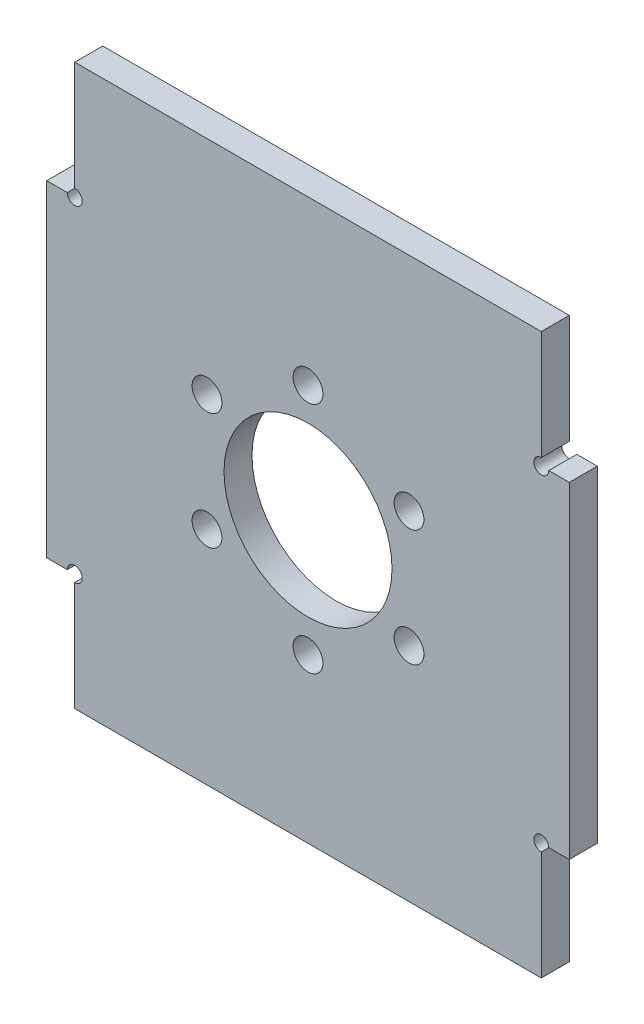
ISO-10303-21;
HEADER;
FILE_DESCRIPTION(('STEP AP214'),'2;1');
FILE_NAME('part.step','',(''),(''),'','','');
FILE_SCHEMA(('AUTOMOTIVE_DESIGN { 1 0 10303 214 1 1 1 1 }'));
ENDSEC;
DATA;
#1=APPLICATION_CONTEXT('core data for automotive mechanical design processes');
#2=APPLICATION_PROTOCOL_DEFINITION('international standard','automotive_design',2000,#1);
#3=PRODUCT_CONTEXT('',#1,'mechanical');
#4=PRODUCT('Part','Part','',(#3));
#5=PRODUCT_RELATED_PRODUCT_CATEGORY('part','',(#4));
#6=PRODUCT_DEFINITION_FORMATION('','',#4);
#7=PRODUCT_DEFINITION_CONTEXT('part definition',#1,'design');
#8=PRODUCT_DEFINITION('design','',#6,#7);
#9=PRODUCT_DEFINITION_SHAPE('','',#8);
#10=(LENGTH_UNIT() NAMED_UNIT(*) SI_UNIT(.MILLI.,.METRE.));
#11=(NAMED_UNIT(*) PLANE_ANGLE_UNIT() SI_UNIT($,.RADIAN.));
#12=(NAMED_UNIT(*) SI_UNIT($,.STERADIAN.) SOLID_ANGLE_UNIT());
#13=UNCERTAINTY_MEASURE_WITH_UNIT(LENGTH_MEASURE(1.E-05),#10,'distance_accuracy_value','');
#14=(GEOMETRIC_REPRESENTATION_CONTEXT(3) GLOBAL_UNCERTAINTY_ASSIGNED_CONTEXT((#13)) GLOBAL_UNIT_ASSIGNED_CONTEXT((#10,
#11,#12)) REPRESENTATION_CONTEXT('',''));
#15=CARTESIAN_POINT('',(0.,0.,0.));
#16=DIRECTION('',(0.,0.,1.));
#17=DIRECTION('',(1.,0.,0.));
#18=AXIS2_PLACEMENT_3D('',#15,#16,#17);
#19=CARTESIAN_POINT('',(25.,0.,3.));
#20=DIRECTION('',(-1.,0.,0.));
#21=DIRECTION('',(0.,0.,1.));
#22=AXIS2_PLACEMENT_3D('',#19,#20,#21);
#23=PLANE('',#22);
#24=DIRECTION('',(0.,1.,0.));
#25=VECTOR('',#24,1.);
#26=CARTESIAN_POINT('',(25.,0.,0.));
#27=LINE('',#26,#25);
#28=CARTESIAN_POINT('',(25.,-30.,0.));
#29=VERTEX_POINT('',#28);
#30=CARTESIAN_POINT('',(25.,-18.3,0.));
#31=VERTEX_POINT('',#30);
#32=EDGE_CURVE('E216',#29,#31,#27,.T.);
#33=ORIENTED_EDGE('',*,*,#32,.T.);
#34=DIRECTION('',(0.,0.,1.));
#35=VECTOR('',#34,1.);
#36=CARTESIAN_POINT('',(25.,-18.3,0.));
#37=LINE('',#36,#35);
#38=CARTESIAN_POINT('',(25.,-18.3,3.));
#39=VERTEX_POINT('',#38);
#40=EDGE_CURVE('E156',#31,#39,#37,.T.);
#41=ORIENTED_EDGE('',*,*,#40,.T.);
#42=DIRECTION('',(0.,1.,0.));
#43=VECTOR('',#42,1.);
#44=CARTESIAN_POINT('',(25.,0.,3.));
#45=LINE('',#44,#43);
#46=CARTESIAN_POINT('',(25.,-30.,3.));
#47=VERTEX_POINT('',#46);
#48=EDGE_CURVE('E174',#47,#39,#45,.T.);
#49=ORIENTED_EDGE('',*,*,#48,.F.);
#50=DIRECTION('',(0.,0.,-1.));
#51=VECTOR('',#50,1.);
#52=CARTESIAN_POINT('',(25.,-30.,3.));
#53=LINE('',#52,#51);
#54=EDGE_CURVE('E232',#47,#29,#53,.T.);
#55=ORIENTED_EDGE('',*,*,#54,.T.);
#56=EDGE_LOOP('',(#33,#41,#49,#55));
#57=FACE_BOUND('',#56,.T.);
#58=ADVANCED_FACE('F35',(#57),#23,.F.);
#59=CARTESIAN_POINT('',(-25.,0.,3.));
#60=DIRECTION('',(-1.,0.,0.));
#61=DIRECTION('',(0.,0.,1.));
#62=AXIS2_PLACEMENT_3D('',#59,#60,#61);
#63=PLANE('',#62);
#64=DIRECTION('',(0.,0.,1.));
#65=VECTOR('',#64,1.);
#66=CARTESIAN_POINT('',(-25.,-18.3,0.));
#67=LINE('',#66,#65);
#68=CARTESIAN_POINT('',(-25.,-18.3,0.));
#69=VERTEX_POINT('',#68);
#70=CARTESIAN_POINT('',(-25.,-18.3,3.));
#71=VERTEX_POINT('',#70);
#72=EDGE_CURVE('E524',#69,#71,#67,.T.);
#73=ORIENTED_EDGE('',*,*,#72,.F.);
#74=DIRECTION('',(0.,1.,0.));
#75=VECTOR('',#74,1.);
#76=CARTESIAN_POINT('',(-25.,0.,0.));
#77=LINE('',#76,#75);
#78=CARTESIAN_POINT('',(-25.,-30.,0.));
#79=VERTEX_POINT('',#78);
#80=EDGE_CURVE('E223',#79,#69,#77,.T.);
#81=ORIENTED_EDGE('',*,*,#80,.F.);
#82=DIRECTION('',(0.,0.,-1.));
#83=VECTOR('',#82,1.);
#84=CARTESIAN_POINT('',(-25.,-30.,3.));
#85=LINE('',#84,#83);
#86=CARTESIAN_POINT('',(-25.,-30.,3.));
#87=VERTEX_POINT('',#86);
#88=EDGE_CURVE('E189',#87,#79,#85,.T.);
#89=ORIENTED_EDGE('',*,*,#88,.F.);
#90=DIRECTION('',(0.,1.,0.));
#91=VECTOR('',#90,1.);
#92=CARTESIAN_POINT('',(-25.,0.,3.));
#93=LINE('',#92,#91);
#94=EDGE_CURVE('E186',#87,#71,#93,.T.);
#95=ORIENTED_EDGE('',*,*,#94,.T.);
#96=EDGE_LOOP('',(#73,#81,#89,#95));
#97=FACE_BOUND('',#96,.T.);
#98=ADVANCED_FACE('F310',(#97),#63,.T.);
#99=CARTESIAN_POINT('',(0.,-30.,3.));
#100=DIRECTION('',(0.,1.,0.));
#101=DIRECTION('',(0.,0.,1.));
#102=AXIS2_PLACEMENT_3D('',#99,#100,#101);
#103=PLANE('',#102);
#104=DIRECTION('',(1.,0.,0.));
#105=VECTOR('',#104,1.);
#106=CARTESIAN_POINT('',(0.,-30.,0.));
#107=LINE('',#106,#105);
#108=EDGE_CURVE('E212',#79,#29,#107,.T.);
#109=ORIENTED_EDGE('',*,*,#108,.T.);
#110=ORIENTED_EDGE('',*,*,#54,.F.);
#111=DIRECTION('',(1.,0.,0.));
#112=VECTOR('',#111,1.);
#113=CARTESIAN_POINT('',(0.,-30.,3.));
#114=LINE('',#113,#112);
#115=EDGE_CURVE('E175',#87,#47,#114,.T.);
#116=ORIENTED_EDGE('',*,*,#115,.F.);
#117=ORIENTED_EDGE('',*,*,#88,.T.);
#118=EDGE_LOOP('',(#109,#110,#116,#117));
#119=FACE_BOUND('',#118,.T.);
#120=ADVANCED_FACE('F319',(#119),#103,.F.);
#121=CARTESIAN_POINT('',(25.,18.3,3.));
#122=VERTEX_POINT('',#121);
#123=CARTESIAN_POINT('',(25.,30.,3.));
#124=VERTEX_POINT('',#123);
#125=EDGE_CURVE('E163',#122,#124,#45,.T.);
#126=ORIENTED_EDGE('',*,*,#125,.F.);
#127=DIRECTION('',(0.,0.,1.));
#128=VECTOR('',#127,1.);
#129=CARTESIAN_POINT('',(25.,18.3,0.));
#130=LINE('',#129,#128);
#131=CARTESIAN_POINT('',(25.,18.3,0.));
#132=VERTEX_POINT('',#131);
#133=EDGE_CURVE('E146',#122,#132,#130,.F.);
#134=ORIENTED_EDGE('',*,*,#133,.T.);
#135=CARTESIAN_POINT('',(25.,30.,0.));
#136=VERTEX_POINT('',#135);
#137=EDGE_CURVE('E215',#132,#136,#27,.T.);
#138=ORIENTED_EDGE('',*,*,#137,.T.);
#139=DIRECTION('',(0.,0.,-1.));
#140=VECTOR('',#139,1.);
#141=CARTESIAN_POINT('',(25.,30.,3.));
#142=LINE('',#141,#140);
#143=EDGE_CURVE('E172',#124,#136,#142,.T.);
#144=ORIENTED_EDGE('',*,*,#143,.F.);
#145=EDGE_LOOP('',(#126,#134,#138,#144));
#146=FACE_BOUND('',#145,.T.);
#147=ADVANCED_FACE('F170',(#146),#23,.F.);
#148=CARTESIAN_POINT('',(0.,30.,3.));
#149=DIRECTION('',(0.,1.,0.));
#150=DIRECTION('',(0.,0.,1.));
#151=AXIS2_PLACEMENT_3D('',#148,#149,#150);
#152=PLANE('',#151);
#153=DIRECTION('',(1.,0.,0.));
#154=VECTOR('',#153,1.);
#155=CARTESIAN_POINT('',(0.,30.,0.));
#156=LINE('',#155,#154);
#157=CARTESIAN_POINT('',(-25.,30.,0.));
#158=VERTEX_POINT('',#157);
#159=EDGE_CURVE('E219',#158,#136,#156,.T.);
#160=ORIENTED_EDGE('',*,*,#159,.F.);
#161=DIRECTION('',(0.,0.,-1.));
#162=VECTOR('',#161,1.);
#163=CARTESIAN_POINT('',(-25.,30.,3.));
#164=LINE('',#163,#162);
#165=CARTESIAN_POINT('',(-25.,30.,3.));
#166=VERTEX_POINT('',#165);
#167=EDGE_CURVE('E228',#166,#158,#164,.T.);
#168=ORIENTED_EDGE('',*,*,#167,.F.);
#169=DIRECTION('',(1.,0.,0.));
#170=VECTOR('',#169,1.);
#171=CARTESIAN_POINT('',(0.,30.,3.));
#172=LINE('',#171,#170);
#173=EDGE_CURVE('E178',#166,#124,#172,.T.);
#174=ORIENTED_EDGE('',*,*,#173,.T.);
#175=ORIENTED_EDGE('',*,*,#143,.T.);
#176=EDGE_LOOP('',(#160,#168,#174,#175));
#177=FACE_BOUND('',#176,.T.);
#178=ADVANCED_FACE('F324',(#177),#152,.T.);
#179=CARTESIAN_POINT('',(0.,12.5,3.));
#180=DIRECTION('',(0.,0.,-1.));
#181=DIRECTION('',(-1.,0.,0.));
#182=AXIS2_PLACEMENT_3D('',#179,#180,#181);
#183=CYLINDRICAL_SURFACE('',#182,1.6);
#184=CARTESIAN_POINT('',(0.,12.5,3.));
#185=DIRECTION('',(0.,0.,1.));
#186=DIRECTION('',(1.,0.,0.));
#187=AXIS2_PLACEMENT_3D('',#184,#185,#186);
#188=CIRCLE('',#187,1.6);
#189=CARTESIAN_POINT('',(1.6,12.5,3.));
#190=VERTEX_POINT('',#189);
#191=EDGE_CURVE('E180',#190,#190,#188,.T.);
#192=ORIENTED_EDGE('',*,*,#191,.T.);
#193=EDGE_LOOP('',(#192));
#194=FACE_BOUND('',#193,.T.);
#195=CARTESIAN_POINT('',(0.,12.5,0.));
#196=DIRECTION('',(0.,0.,1.));
#197=DIRECTION('',(1.,0.,0.));
#198=AXIS2_PLACEMENT_3D('',#195,#196,#197);
#199=CIRCLE('',#198,1.6);
#200=CARTESIAN_POINT('',(1.6,12.5,0.));
#201=VERTEX_POINT('',#200);
#202=EDGE_CURVE('E209',#201,#201,#199,.T.);
#203=ORIENTED_EDGE('',*,*,#202,.F.);
#204=EDGE_LOOP('',(#203));
#205=FACE_BOUND('',#204,.T.);
#206=ADVANCED_FACE('F293',(#194,#205),#183,.F.);
#207=CARTESIAN_POINT('',(10.8253175473055,6.25000000000001,3.));
#208=DIRECTION('',(0.,0.,-1.));
#209=DIRECTION('',(-1.,0.,0.));
#210=AXIS2_PLACEMENT_3D('',#207,#208,#209);
#211=CYLINDRICAL_SURFACE('',#210,1.6);
#212=CARTESIAN_POINT('',(10.8253175473055,6.25000000000001,3.));
#213=DIRECTION('',(0.,0.,1.));
#214=DIRECTION('',(1.,0.,0.));
#215=AXIS2_PLACEMENT_3D('',#212,#213,#214);
#216=CIRCLE('',#215,1.6);
#217=CARTESIAN_POINT('',(12.4253175473055,6.25000000000001,3.));
#218=VERTEX_POINT('',#217);
#219=EDGE_CURVE('E288',#218,#218,#216,.T.);
#220=ORIENTED_EDGE('',*,*,#219,.T.);
#221=EDGE_LOOP('',(#220));
#222=FACE_BOUND('',#221,.T.);
#223=CARTESIAN_POINT('',(10.8253175473055,6.25000000000001,0.));
#224=DIRECTION('',(0.,0.,1.));
#225=DIRECTION('',(1.,0.,0.));
#226=AXIS2_PLACEMENT_3D('',#223,#224,#225);
#227=CIRCLE('',#226,1.6);
#228=CARTESIAN_POINT('',(12.4253175473055,6.25000000000001,0.));
#229=VERTEX_POINT('',#228);
#230=EDGE_CURVE('E206',#229,#229,#227,.T.);
#231=ORIENTED_EDGE('',*,*,#230,.F.);
#232=EDGE_LOOP('',(#231));
#233=FACE_BOUND('',#232,.T.);
#234=ADVANCED_FACE('F336',(#222,#233),#211,.F.);
#235=CARTESIAN_POINT('',(10.8253175473055,-6.25,3.));
#236=DIRECTION('',(0.,0.,-1.));
#237=DIRECTION('',(-1.,0.,0.));
#238=AXIS2_PLACEMENT_3D('',#235,#236,#237);
#239=CYLINDRICAL_SURFACE('',#238,1.6);
#240=CARTESIAN_POINT('',(10.8253175473055,-6.25,3.));
#241=DIRECTION('',(0.,0.,1.));
#242=DIRECTION('',(1.,0.,0.));
#243=AXIS2_PLACEMENT_3D('',#240,#241,#242);
#244=CIRCLE('',#243,1.6);
#245=CARTESIAN_POINT('',(12.4253175473055,-6.25,3.));
#246=VERTEX_POINT('',#245);
#247=EDGE_CURVE('E285',#246,#246,#244,.T.);
#248=ORIENTED_EDGE('',*,*,#247,.T.);
#249=EDGE_LOOP('',(#248));
#250=FACE_BOUND('',#249,.T.);
#251=CARTESIAN_POINT('',(10.8253175473055,-6.25,0.));
#252=DIRECTION('',(0.,0.,1.));
#253=DIRECTION('',(1.,0.,0.));
#254=AXIS2_PLACEMENT_3D('',#251,#252,#253);
#255=CIRCLE('',#254,1.6);
#256=CARTESIAN_POINT('',(12.4253175473055,-6.25,0.));
#257=VERTEX_POINT('',#256);
#258=EDGE_CURVE('E203',#257,#257,#255,.T.);
#259=ORIENTED_EDGE('',*,*,#258,.F.);
#260=EDGE_LOOP('',(#259));
#261=FACE_BOUND('',#260,.T.);
#262=ADVANCED_FACE('F339',(#250,#261),#239,.F.);
#263=CARTESIAN_POINT('',(0.,-12.5,3.));
#264=DIRECTION('',(0.,0.,-1.));
#265=DIRECTION('',(-1.,0.,0.));
#266=AXIS2_PLACEMENT_3D('',#263,#264,#265);
#267=CYLINDRICAL_SURFACE('',#266,1.6);
#268=CARTESIAN_POINT('',(0.,-12.5,3.));
#269=DIRECTION('',(0.,0.,1.));
#270=DIRECTION('',(1.,0.,0.));
#271=AXIS2_PLACEMENT_3D('',#268,#269,#270);
#272=CIRCLE('',#271,1.6);
#273=CARTESIAN_POINT('',(1.6,-12.5,3.));
#274=VERTEX_POINT('',#273);
#275=EDGE_CURVE('E282',#274,#274,#272,.T.);
#276=ORIENTED_EDGE('',*,*,#275,.T.);
#277=EDGE_LOOP('',(#276));
#278=FACE_BOUND('',#277,.T.);
#279=CARTESIAN_POINT('',(0.,-12.5,0.));
#280=DIRECTION('',(0.,0.,1.));
#281=DIRECTION('',(1.,0.,0.));
#282=AXIS2_PLACEMENT_3D('',#279,#280,#281);
#283=CIRCLE('',#282,1.6);
#284=CARTESIAN_POINT('',(1.6,-12.5,0.));
#285=VERTEX_POINT('',#284);
#286=EDGE_CURVE('E200',#285,#285,#283,.T.);
#287=ORIENTED_EDGE('',*,*,#286,.F.);
#288=EDGE_LOOP('',(#287));
#289=FACE_BOUND('',#288,.T.);
#290=ADVANCED_FACE('F343',(#278,#289),#267,.F.);
#291=CARTESIAN_POINT('',(-10.8253175473055,-6.25000000000001,3.));
#292=DIRECTION('',(0.,0.,-1.));
#293=DIRECTION('',(-1.,0.,0.));
#294=AXIS2_PLACEMENT_3D('',#291,#292,#293);
#295=CYLINDRICAL_SURFACE('',#294,1.6);
#296=CARTESIAN_POINT('',(-10.8253175473055,-6.25000000000001,3.));
#297=DIRECTION('',(0.,0.,1.));
#298=DIRECTION('',(1.,0.,0.));
#299=AXIS2_PLACEMENT_3D('',#296,#297,#298);
#300=CIRCLE('',#299,1.6);
#301=CARTESIAN_POINT('',(-9.22531754730548,-6.25000000000001,3.));
#302=VERTEX_POINT('',#301);
#303=EDGE_CURVE('E279',#302,#302,#300,.T.);
#304=ORIENTED_EDGE('',*,*,#303,.T.);
#305=EDGE_LOOP('',(#304));
#306=FACE_BOUND('',#305,.T.);
#307=CARTESIAN_POINT('',(-10.8253175473055,-6.25000000000001,0.));
#308=DIRECTION('',(0.,0.,1.));
#309=DIRECTION('',(1.,0.,0.));
#310=AXIS2_PLACEMENT_3D('',#307,#308,#309);
#311=CIRCLE('',#310,1.6);
#312=CARTESIAN_POINT('',(-9.22531754730548,-6.25000000000001,0.));
#313=VERTEX_POINT('',#312);
#314=EDGE_CURVE('E197',#313,#313,#311,.T.);
#315=ORIENTED_EDGE('',*,*,#314,.F.);
#316=EDGE_LOOP('',(#315));
#317=FACE_BOUND('',#316,.T.);
#318=ADVANCED_FACE('F347',(#306,#317),#295,.F.);
#319=CARTESIAN_POINT('',(-10.8253175473055,6.24999999999999,3.));
#320=DIRECTION('',(0.,0.,-1.));
#321=DIRECTION('',(-1.,0.,0.));
#322=AXIS2_PLACEMENT_3D('',#319,#320,#321);
#323=CYLINDRICAL_SURFACE('',#322,1.6);
#324=CARTESIAN_POINT('',(-10.8253175473055,6.24999999999999,3.));
#325=DIRECTION('',(0.,0.,1.));
#326=DIRECTION('',(1.,0.,0.));
#327=AXIS2_PLACEMENT_3D('',#324,#325,#326);
#328=CIRCLE('',#327,1.6);
#329=CARTESIAN_POINT('',(-9.22531754730549,6.24999999999999,3.));
#330=VERTEX_POINT('',#329);
#331=EDGE_CURVE('E276',#330,#330,#328,.T.);
#332=ORIENTED_EDGE('',*,*,#331,.T.);
#333=EDGE_LOOP('',(#332));
#334=FACE_BOUND('',#333,.T.);
#335=CARTESIAN_POINT('',(-10.8253175473055,6.24999999999999,0.));
#336=DIRECTION('',(0.,0.,1.));
#337=DIRECTION('',(1.,0.,0.));
#338=AXIS2_PLACEMENT_3D('',#335,#336,#337);
#339=CIRCLE('',#338,1.6);
#340=CARTESIAN_POINT('',(-9.22531754730549,6.24999999999999,0.));
#341=VERTEX_POINT('',#340);
#342=EDGE_CURVE('E193',#341,#341,#339,.T.);
#343=ORIENTED_EDGE('',*,*,#342,.F.);
#344=EDGE_LOOP('',(#343));
#345=FACE_BOUND('',#344,.T.);
#346=ADVANCED_FACE('F350',(#334,#345),#323,.F.);
#347=CARTESIAN_POINT('',(0.,0.,3.));
#348=DIRECTION('',(0.,0.,-1.));
#349=DIRECTION('',(-1.,0.,0.));
#350=AXIS2_PLACEMENT_3D('',#347,#348,#349);
#351=CYLINDRICAL_SURFACE('',#350,9.);
#352=CARTESIAN_POINT('',(0.,0.,3.));
#353=DIRECTION('',(0.,0.,1.));
#354=DIRECTION('',(1.,0.,0.));
#355=AXIS2_PLACEMENT_3D('',#352,#353,#354);
#356=CIRCLE('',#355,9.);
#357=CARTESIAN_POINT('',(9.,0.,3.));
#358=VERTEX_POINT('',#357);
#359=EDGE_CURVE('E226',#358,#358,#356,.T.);
#360=ORIENTED_EDGE('',*,*,#359,.T.);
#361=EDGE_LOOP('',(#360));
#362=FACE_BOUND('',#361,.T.);
#363=CARTESIAN_POINT('',(0.,0.,0.));
#364=DIRECTION('',(0.,0.,1.));
#365=DIRECTION('',(1.,0.,0.));
#366=AXIS2_PLACEMENT_3D('',#363,#364,#365);
#367=CIRCLE('',#366,9.);
#368=CARTESIAN_POINT('',(9.,0.,0.));
#369=VERTEX_POINT('',#368);
#370=EDGE_CURVE('E190',#369,#369,#367,.T.);
#371=ORIENTED_EDGE('',*,*,#370,.F.);
#372=EDGE_LOOP('',(#371));
#373=FACE_BOUND('',#372,.T.);
#374=ADVANCED_FACE('F37',(#362,#373),#351,.F.);
#375=DIRECTION('',(0.,0.,1.));
#376=VECTOR('',#375,1.);
#377=CARTESIAN_POINT('',(-25.,18.3,0.));
#378=LINE('',#377,#376);
#379=CARTESIAN_POINT('',(-25.,18.3,3.));
#380=VERTEX_POINT('',#379);
#381=CARTESIAN_POINT('',(-25.,18.3,0.));
#382=VERTEX_POINT('',#381);
#383=EDGE_CURVE('E528',#380,#382,#378,.F.);
#384=ORIENTED_EDGE('',*,*,#383,.F.);
#385=EDGE_CURVE('E185',#380,#166,#93,.T.);
#386=ORIENTED_EDGE('',*,*,#385,.T.);
#387=ORIENTED_EDGE('',*,*,#167,.T.);
#388=EDGE_CURVE('E222',#382,#158,#77,.T.);
#389=ORIENTED_EDGE('',*,*,#388,.F.);
#390=EDGE_LOOP('',(#384,#386,#387,#389));
#391=FACE_BOUND('',#390,.T.);
#392=ADVANCED_FACE('F298',(#391),#63,.T.);
#393=CARTESIAN_POINT('',(0.,0.,3.));
#394=DIRECTION('',(0.,0.,1.));
#395=DIRECTION('',(1.,0.,0.));
#396=AXIS2_PLACEMENT_3D('',#393,#394,#395);
#397=PLANE('',#396);
#398=CARTESIAN_POINT('',(-25.,-17.5,3.));
#399=DIRECTION('',(0.,0.,1.));
#400=DIRECTION('',(1.,0.,0.));
#401=AXIS2_PLACEMENT_3D('',#398,#399,#400);
#402=CIRCLE('',#401,0.799999999999999);
#403=CARTESIAN_POINT('',(-25.8,-17.5,3.));
#404=VERTEX_POINT('',#403);
#405=EDGE_CURVE('E49',#71,#404,#402,.T.);
#406=ORIENTED_EDGE('',*,*,#405,.F.);
#407=ORIENTED_EDGE('',*,*,#94,.F.);
#408=ORIENTED_EDGE('',*,*,#115,.T.);
#409=ORIENTED_EDGE('',*,*,#48,.T.);
#410=CARTESIAN_POINT('',(25.,-17.5,3.));
#411=DIRECTION('',(0.,0.,1.));
#412=DIRECTION('',(1.,0.,0.));
#413=AXIS2_PLACEMENT_3D('',#410,#411,#412);
#414=CIRCLE('',#413,0.799999999999999);
#415=CARTESIAN_POINT('',(25.8,-17.5,3.));
#416=VERTEX_POINT('',#415);
#417=EDGE_CURVE('E537',#416,#39,#414,.T.);
#418=ORIENTED_EDGE('',*,*,#417,.F.);
#419=DIRECTION('',(1.,0.,0.));
#420=VECTOR('',#419,1.);
#421=CARTESIAN_POINT('',(28.,-17.5,3.));
#422=LINE('',#421,#420);
#423=CARTESIAN_POINT('',(28.,-17.5,3.));
#424=VERTEX_POINT('',#423);
#425=EDGE_CURVE('E551',#416,#424,#422,.T.);
#426=ORIENTED_EDGE('',*,*,#425,.T.);
#427=DIRECTION('',(0.,1.,0.));
#428=VECTOR('',#427,1.);
#429=CARTESIAN_POINT('',(28.,-17.5,3.));
#430=LINE('',#429,#428);
#431=CARTESIAN_POINT('',(28.,17.5,3.));
#432=VERTEX_POINT('',#431);
#433=EDGE_CURVE('E527',#424,#432,#430,.T.);
#434=ORIENTED_EDGE('',*,*,#433,.T.);
#435=DIRECTION('',(-1.,0.,0.));
#436=VECTOR('',#435,1.);
#437=CARTESIAN_POINT('',(28.,17.5,3.));
#438=LINE('',#437,#436);
#439=CARTESIAN_POINT('',(25.8,17.5,3.));
#440=VERTEX_POINT('',#439);
#441=EDGE_CURVE('E167',#432,#440,#438,.T.);
#442=ORIENTED_EDGE('',*,*,#441,.T.);
#443=CARTESIAN_POINT('',(25.,17.5,3.));
#444=DIRECTION('',(0.,0.,1.));
#445=DIRECTION('',(1.,0.,0.));
#446=AXIS2_PLACEMENT_3D('',#443,#444,#445);
#447=CIRCLE('',#446,0.799999999999999);
#448=EDGE_CURVE('E149',#122,#440,#447,.T.);
#449=ORIENTED_EDGE('',*,*,#448,.F.);
#450=ORIENTED_EDGE('',*,*,#125,.T.);
#451=ORIENTED_EDGE('',*,*,#173,.F.);
#452=ORIENTED_EDGE('',*,*,#385,.F.);
#453=CARTESIAN_POINT('',(-25.,17.5,3.));
#454=DIRECTION('',(0.,0.,1.));
#455=DIRECTION('',(1.,0.,0.));
#456=AXIS2_PLACEMENT_3D('',#453,#454,#455);
#457=CIRCLE('',#456,0.799999999999999);
#458=CARTESIAN_POINT('',(-25.8,17.5,3.));
#459=VERTEX_POINT('',#458);
#460=EDGE_CURVE('E240',#459,#380,#457,.T.);
#461=ORIENTED_EDGE('',*,*,#460,.F.);
#462=DIRECTION('',(-1.,0.,0.));
#463=VECTOR('',#462,1.);
#464=CARTESIAN_POINT('',(-28.,17.5,3.));
#465=LINE('',#464,#463);
#466=CARTESIAN_POINT('',(-28.,17.5,3.));
#467=VERTEX_POINT('',#466);
#468=EDGE_CURVE('E248',#459,#467,#465,.T.);
#469=ORIENTED_EDGE('',*,*,#468,.T.);
#470=DIRECTION('',(0.,-1.,0.));
#471=VECTOR('',#470,1.);
#472=CARTESIAN_POINT('',(-28.,-17.5,3.));
#473=LINE('',#472,#471);
#474=CARTESIAN_POINT('',(-28.,-17.5,3.));
#475=VERTEX_POINT('',#474);
#476=EDGE_CURVE('E256',#467,#475,#473,.T.);
#477=ORIENTED_EDGE('',*,*,#476,.T.);
#478=DIRECTION('',(1.,0.,0.));
#479=VECTOR('',#478,1.);
#480=CARTESIAN_POINT('',(-28.,-17.5,3.));
#481=LINE('',#480,#479);
#482=EDGE_CURVE('E259',#475,#404,#481,.T.);
#483=ORIENTED_EDGE('',*,*,#482,.T.);
#484=EDGE_LOOP('',(#406,#407,#408,#409,#418,#426,#434,#442,#449,#450,#451,#452,#461,#469,#477,#483));
#485=FACE_BOUND('',#484,.T.);
#486=ORIENTED_EDGE('',*,*,#359,.F.);
#487=EDGE_LOOP('',(#486));
#488=FACE_BOUND('',#487,.T.);
#489=ORIENTED_EDGE('',*,*,#331,.F.);
#490=EDGE_LOOP('',(#489));
#491=FACE_BOUND('',#490,.T.);
#492=ORIENTED_EDGE('',*,*,#303,.F.);
#493=EDGE_LOOP('',(#492));
#494=FACE_BOUND('',#493,.T.);
#495=ORIENTED_EDGE('',*,*,#275,.F.);
#496=EDGE_LOOP('',(#495));
#497=FACE_BOUND('',#496,.T.);
#498=ORIENTED_EDGE('',*,*,#247,.F.);
#499=EDGE_LOOP('',(#498));
#500=FACE_BOUND('',#499,.T.);
#501=ORIENTED_EDGE('',*,*,#219,.F.);
#502=EDGE_LOOP('',(#501));
#503=FACE_BOUND('',#502,.T.);
#504=ORIENTED_EDGE('',*,*,#191,.F.);
#505=EDGE_LOOP('',(#504));
#506=FACE_BOUND('',#505,.T.);
#507=ADVANCED_FACE('F160',(#485,#488,#491,#494,#497,#500,#503,#506),#397,.T.);
#508=CARTESIAN_POINT('',(0.,0.,0.));
#509=DIRECTION('',(0.,0.,1.));
#510=DIRECTION('',(1.,0.,0.));
#511=AXIS2_PLACEMENT_3D('',#508,#509,#510);
#512=PLANE('',#511);
#513=ORIENTED_EDGE('',*,*,#80,.T.);
#514=CARTESIAN_POINT('',(-25.,-17.5,0.));
#515=DIRECTION('',(0.,0.,1.));
#516=DIRECTION('',(1.,0.,0.));
#517=AXIS2_PLACEMENT_3D('',#514,#515,#516);
#518=CIRCLE('',#517,0.799999999999999);
#519=CARTESIAN_POINT('',(-25.8,-17.5,0.));
#520=VERTEX_POINT('',#519);
#521=EDGE_CURVE('E250',#69,#520,#518,.T.);
#522=ORIENTED_EDGE('',*,*,#521,.T.);
#523=DIRECTION('',(-1.,0.,0.));
#524=VECTOR('',#523,1.);
#525=CARTESIAN_POINT('',(-28.,-17.5,0.));
#526=LINE('',#525,#524);
#527=CARTESIAN_POINT('',(-28.,-17.5,0.));
#528=VERTEX_POINT('',#527);
#529=EDGE_CURVE('E264',#520,#528,#526,.T.);
#530=ORIENTED_EDGE('',*,*,#529,.T.);
#531=DIRECTION('',(0.,1.,0.));
#532=VECTOR('',#531,1.);
#533=CARTESIAN_POINT('',(-28.,-17.5,0.));
#534=LINE('',#533,#532);
#535=CARTESIAN_POINT('',(-28.,17.5,0.));
#536=VERTEX_POINT('',#535);
#537=EDGE_CURVE('E271',#528,#536,#534,.T.);
#538=ORIENTED_EDGE('',*,*,#537,.T.);
#539=DIRECTION('',(1.,0.,0.));
#540=VECTOR('',#539,1.);
#541=CARTESIAN_POINT('',(-28.,17.5,0.));
#542=LINE('',#541,#540);
#543=CARTESIAN_POINT('',(-25.8,17.5,0.));
#544=VERTEX_POINT('',#543);
#545=EDGE_CURVE('E194',#536,#544,#542,.T.);
#546=ORIENTED_EDGE('',*,*,#545,.T.);
#547=CARTESIAN_POINT('',(-25.,17.5,0.));
#548=DIRECTION('',(0.,0.,1.));
#549=DIRECTION('',(1.,0.,0.));
#550=AXIS2_PLACEMENT_3D('',#547,#548,#549);
#551=CIRCLE('',#550,0.799999999999999);
#552=EDGE_CURVE('E57',#544,#382,#551,.T.);
#553=ORIENTED_EDGE('',*,*,#552,.T.);
#554=ORIENTED_EDGE('',*,*,#388,.T.);
#555=ORIENTED_EDGE('',*,*,#159,.T.);
#556=ORIENTED_EDGE('',*,*,#137,.F.);
#557=CARTESIAN_POINT('',(25.,17.5,0.));
#558=DIRECTION('',(0.,0.,1.));
#559=DIRECTION('',(1.,0.,0.));
#560=AXIS2_PLACEMENT_3D('',#557,#558,#559);
#561=CIRCLE('',#560,0.799999999999999);
#562=CARTESIAN_POINT('',(25.8,17.5,0.));
#563=VERTEX_POINT('',#562);
#564=EDGE_CURVE('E152',#132,#563,#561,.T.);
#565=ORIENTED_EDGE('',*,*,#564,.T.);
#566=DIRECTION('',(1.,0.,0.));
#567=VECTOR('',#566,1.);
#568=CARTESIAN_POINT('',(28.,17.5,0.));
#569=LINE('',#568,#567);
#570=CARTESIAN_POINT('',(28.,17.5,0.));
#571=VERTEX_POINT('',#570);
#572=EDGE_CURVE('E257',#563,#571,#569,.T.);
#573=ORIENTED_EDGE('',*,*,#572,.T.);
#574=DIRECTION('',(0.,-1.,0.));
#575=VECTOR('',#574,1.);
#576=CARTESIAN_POINT('',(28.,-17.5,0.));
#577=LINE('',#576,#575);
#578=CARTESIAN_POINT('',(28.,-17.5,0.));
#579=VERTEX_POINT('',#578);
#580=EDGE_CURVE('E261',#571,#579,#577,.T.);
#581=ORIENTED_EDGE('',*,*,#580,.T.);
#582=DIRECTION('',(-1.,0.,0.));
#583=VECTOR('',#582,1.);
#584=CARTESIAN_POINT('',(28.,-17.5,0.));
#585=LINE('',#584,#583);
#586=CARTESIAN_POINT('',(25.8,-17.5,0.));
#587=VERTEX_POINT('',#586);
#588=EDGE_CURVE('E544',#579,#587,#585,.T.);
#589=ORIENTED_EDGE('',*,*,#588,.T.);
#590=CARTESIAN_POINT('',(25.,-17.5,0.));
#591=DIRECTION('',(0.,0.,1.));
#592=DIRECTION('',(1.,0.,0.));
#593=AXIS2_PLACEMENT_3D('',#590,#591,#592);
#594=CIRCLE('',#593,0.799999999999999);
#595=EDGE_CURVE('E168',#587,#31,#594,.T.);
#596=ORIENTED_EDGE('',*,*,#595,.T.);
#597=ORIENTED_EDGE('',*,*,#32,.F.);
#598=ORIENTED_EDGE('',*,*,#108,.F.);
#599=EDGE_LOOP('',(#513,#522,#530,#538,#546,#553,#554,#555,#556,#565,#573,#581,#589,#596,#597,#598));
#600=FACE_BOUND('',#599,.T.);
#601=ORIENTED_EDGE('',*,*,#370,.T.);
#602=EDGE_LOOP('',(#601));
#603=FACE_BOUND('',#602,.T.);
#604=ORIENTED_EDGE('',*,*,#342,.T.);
#605=EDGE_LOOP('',(#604));
#606=FACE_BOUND('',#605,.T.);
#607=ORIENTED_EDGE('',*,*,#314,.T.);
#608=EDGE_LOOP('',(#607));
#609=FACE_BOUND('',#608,.T.);
#610=ORIENTED_EDGE('',*,*,#286,.T.);
#611=EDGE_LOOP('',(#610));
#612=FACE_BOUND('',#611,.T.);
#613=ORIENTED_EDGE('',*,*,#258,.T.);
#614=EDGE_LOOP('',(#613));
#615=FACE_BOUND('',#614,.T.);
#616=ORIENTED_EDGE('',*,*,#230,.T.);
#617=EDGE_LOOP('',(#616));
#618=FACE_BOUND('',#617,.T.);
#619=ORIENTED_EDGE('',*,*,#202,.T.);
#620=EDGE_LOOP('',(#619));
#621=FACE_BOUND('',#620,.T.);
#622=ADVANCED_FACE('F297',(#600,#603,#606,#609,#612,#615,#618,#621),#512,.F.);
#623=CARTESIAN_POINT('',(-28.,-17.5,-35.5105618091294));
#624=DIRECTION('',(0.,-1.,0.));
#625=DIRECTION('',(0.,0.,-1.));
#626=AXIS2_PLACEMENT_3D('',#623,#624,#625);
#627=PLANE('',#626);
#628=DIRECTION('',(0.,0.,1.));
#629=VECTOR('',#628,1.);
#630=CARTESIAN_POINT('',(-25.8,-17.5,0.));
#631=LINE('',#630,#629);
#632=EDGE_CURVE('E11',#404,#520,#631,.F.);
#633=ORIENTED_EDGE('',*,*,#632,.F.);
#634=ORIENTED_EDGE('',*,*,#482,.F.);
#635=DIRECTION('',(0.,0.,1.));
#636=VECTOR('',#635,1.);
#637=CARTESIAN_POINT('',(-28.,-17.5,-35.5105618091294));
#638=LINE('',#637,#636);
#639=EDGE_CURVE('E269',#528,#475,#638,.T.);
#640=ORIENTED_EDGE('',*,*,#639,.F.);
#641=ORIENTED_EDGE('',*,*,#529,.F.);
#642=EDGE_LOOP('',(#633,#634,#640,#641));
#643=FACE_BOUND('',#642,.T.);
#644=ADVANCED_FACE('F304',(#643),#627,.T.);
#645=CARTESIAN_POINT('',(-28.,-17.5,-35.5105618091294));
#646=DIRECTION('',(-1.,0.,0.));
#647=DIRECTION('',(0.,0.,1.));
#648=AXIS2_PLACEMENT_3D('',#645,#646,#647);
#649=PLANE('',#648);
#650=ORIENTED_EDGE('',*,*,#537,.F.);
#651=ORIENTED_EDGE('',*,*,#639,.T.);
#652=ORIENTED_EDGE('',*,*,#476,.F.);
#653=DIRECTION('',(0.,0.,1.));
#654=VECTOR('',#653,1.);
#655=CARTESIAN_POINT('',(-28.,17.5,-35.5105618091294));
#656=LINE('',#655,#654);
#657=EDGE_CURVE('E254',#536,#467,#656,.T.);
#658=ORIENTED_EDGE('',*,*,#657,.F.);
#659=EDGE_LOOP('',(#650,#651,#652,#658));
#660=FACE_BOUND('',#659,.T.);
#661=ADVANCED_FACE('F439',(#660),#649,.T.);
#662=CARTESIAN_POINT('',(-28.,17.5,-35.5105618091294));
#663=DIRECTION('',(0.,1.,0.));
#664=DIRECTION('',(0.,0.,1.));
#665=AXIS2_PLACEMENT_3D('',#662,#663,#664);
#666=PLANE('',#665);
#667=DIRECTION('',(0.,0.,1.));
#668=VECTOR('',#667,1.);
#669=CARTESIAN_POINT('',(-25.8,17.5,0.));
#670=LINE('',#669,#668);
#671=EDGE_CURVE('E43',#544,#459,#670,.T.);
#672=ORIENTED_EDGE('',*,*,#671,.F.);
#673=ORIENTED_EDGE('',*,*,#545,.F.);
#674=ORIENTED_EDGE('',*,*,#657,.T.);
#675=ORIENTED_EDGE('',*,*,#468,.F.);
#676=EDGE_LOOP('',(#672,#673,#674,#675));
#677=FACE_BOUND('',#676,.T.);
#678=ADVANCED_FACE('F252',(#677),#666,.T.);
#679=CARTESIAN_POINT('',(28.,-17.5,-35.5105618091294));
#680=DIRECTION('',(0.,-1.,0.));
#681=DIRECTION('',(0.,0.,-1.));
#682=AXIS2_PLACEMENT_3D('',#679,#680,#681);
#683=PLANE('',#682);
#684=DIRECTION('',(0.,0.,1.));
#685=VECTOR('',#684,1.);
#686=CARTESIAN_POINT('',(25.8,-17.5,0.));
#687=LINE('',#686,#685);
#688=EDGE_CURVE('E237',#587,#416,#687,.T.);
#689=ORIENTED_EDGE('',*,*,#688,.F.);
#690=ORIENTED_EDGE('',*,*,#588,.F.);
#691=DIRECTION('',(0.,0.,1.));
#692=VECTOR('',#691,1.);
#693=CARTESIAN_POINT('',(28.,-17.5,-35.5105618091294));
#694=LINE('',#693,#692);
#695=EDGE_CURVE('E547',#579,#424,#694,.T.);
#696=ORIENTED_EDGE('',*,*,#695,.T.);
#697=ORIENTED_EDGE('',*,*,#425,.F.);
#698=EDGE_LOOP('',(#689,#690,#696,#697));
#699=FACE_BOUND('',#698,.T.);
#700=ADVANCED_FACE('F455',(#699),#683,.T.);
#701=CARTESIAN_POINT('',(28.,17.5,-35.5105618091294));
#702=DIRECTION('',(0.,1.,0.));
#703=DIRECTION('',(0.,0.,1.));
#704=AXIS2_PLACEMENT_3D('',#701,#702,#703);
#705=PLANE('',#704);
#706=DIRECTION('',(0.,0.,1.));
#707=VECTOR('',#706,1.);
#708=CARTESIAN_POINT('',(25.8,17.5,0.));
#709=LINE('',#708,#707);
#710=EDGE_CURVE('E235',#440,#563,#709,.F.);
#711=ORIENTED_EDGE('',*,*,#710,.F.);
#712=ORIENTED_EDGE('',*,*,#441,.F.);
#713=DIRECTION('',(0.,0.,1.));
#714=VECTOR('',#713,1.);
#715=CARTESIAN_POINT('',(28.,17.5,-35.5105618091294));
#716=LINE('',#715,#714);
#717=EDGE_CURVE('E553',#571,#432,#716,.T.);
#718=ORIENTED_EDGE('',*,*,#717,.F.);
#719=ORIENTED_EDGE('',*,*,#572,.F.);
#720=EDGE_LOOP('',(#711,#712,#718,#719));
#721=FACE_BOUND('',#720,.T.);
#722=ADVANCED_FACE('F462',(#721),#705,.T.);
#723=CARTESIAN_POINT('',(28.,-17.5,-35.5105618091294));
#724=DIRECTION('',(1.,0.,0.));
#725=DIRECTION('',(0.,0.,-1.));
#726=AXIS2_PLACEMENT_3D('',#723,#724,#725);
#727=PLANE('',#726);
#728=ORIENTED_EDGE('',*,*,#580,.F.);
#729=ORIENTED_EDGE('',*,*,#717,.T.);
#730=ORIENTED_EDGE('',*,*,#433,.F.);
#731=ORIENTED_EDGE('',*,*,#695,.F.);
#732=EDGE_LOOP('',(#728,#729,#730,#731));
#733=FACE_BOUND('',#732,.T.);
#734=ADVANCED_FACE('F471',(#733),#727,.T.);
#735=CARTESIAN_POINT('',(25.,17.5,0.));
#736=DIRECTION('',(0.,0.,1.));
#737=DIRECTION('',(1.,0.,0.));
#738=AXIS2_PLACEMENT_3D('',#735,#736,#737);
#739=CYLINDRICAL_SURFACE('',#738,0.799999999999999);
#740=ORIENTED_EDGE('',*,*,#448,.T.);
#741=ORIENTED_EDGE('',*,*,#710,.T.);
#742=ORIENTED_EDGE('',*,*,#564,.F.);
#743=ORIENTED_EDGE('',*,*,#133,.F.);
#744=EDGE_LOOP('',(#740,#741,#742,#743));
#745=FACE_BOUND('',#744,.T.);
#746=ADVANCED_FACE('F148',(#745),#739,.F.);
#747=CARTESIAN_POINT('',(25.,-17.5,0.));
#748=DIRECTION('',(0.,0.,1.));
#749=DIRECTION('',(1.,0.,0.));
#750=AXIS2_PLACEMENT_3D('',#747,#748,#749);
#751=CYLINDRICAL_SURFACE('',#750,0.799999999999999);
#752=ORIENTED_EDGE('',*,*,#595,.F.);
#753=ORIENTED_EDGE('',*,*,#688,.T.);
#754=ORIENTED_EDGE('',*,*,#417,.T.);
#755=ORIENTED_EDGE('',*,*,#40,.F.);
#756=EDGE_LOOP('',(#752,#753,#754,#755));
#757=FACE_BOUND('',#756,.T.);
#758=ADVANCED_FACE('F487',(#757),#751,.F.);
#759=CARTESIAN_POINT('',(-25.,17.5,0.));
#760=DIRECTION('',(0.,0.,1.));
#761=DIRECTION('',(1.,0.,0.));
#762=AXIS2_PLACEMENT_3D('',#759,#760,#761);
#763=CYLINDRICAL_SURFACE('',#762,0.799999999999999);
#764=ORIENTED_EDGE('',*,*,#383,.T.);
#765=ORIENTED_EDGE('',*,*,#552,.F.);
#766=ORIENTED_EDGE('',*,*,#671,.T.);
#767=ORIENTED_EDGE('',*,*,#460,.T.);
#768=EDGE_LOOP('',(#764,#765,#766,#767));
#769=FACE_BOUND('',#768,.T.);
#770=ADVANCED_FACE('F239',(#769),#763,.F.);
#771=CARTESIAN_POINT('',(-25.,-17.5,0.));
#772=DIRECTION('',(0.,0.,1.));
#773=DIRECTION('',(1.,0.,0.));
#774=AXIS2_PLACEMENT_3D('',#771,#772,#773);
#775=CYLINDRICAL_SURFACE('',#774,0.799999999999999);
#776=ORIENTED_EDGE('',*,*,#72,.T.);
#777=ORIENTED_EDGE('',*,*,#405,.T.);
#778=ORIENTED_EDGE('',*,*,#632,.T.);
#779=ORIENTED_EDGE('',*,*,#521,.F.);
#780=EDGE_LOOP('',(#776,#777,#778,#779));
#781=FACE_BOUND('',#780,.T.);
#782=ADVANCED_FACE('F503',(#781),#775,.F.);
#783=CLOSED_SHELL('',(#58,#98,#120,#147,#178,#206,#234,#262,#290,#318,#346,#374,#392,#507,#622,
#644,#661,#678,#700,#722,#734,#746,#758,#770,#782));
#784=MANIFOLD_SOLID_BREP('B2',#783);
#785=ADVANCED_BREP_SHAPE_REPRESENTATION('',(#18,#784),#14);
#786=SHAPE_DEFINITION_REPRESENTATION(#9,#785);
ENDSEC;
END-ISO-10303-21;
